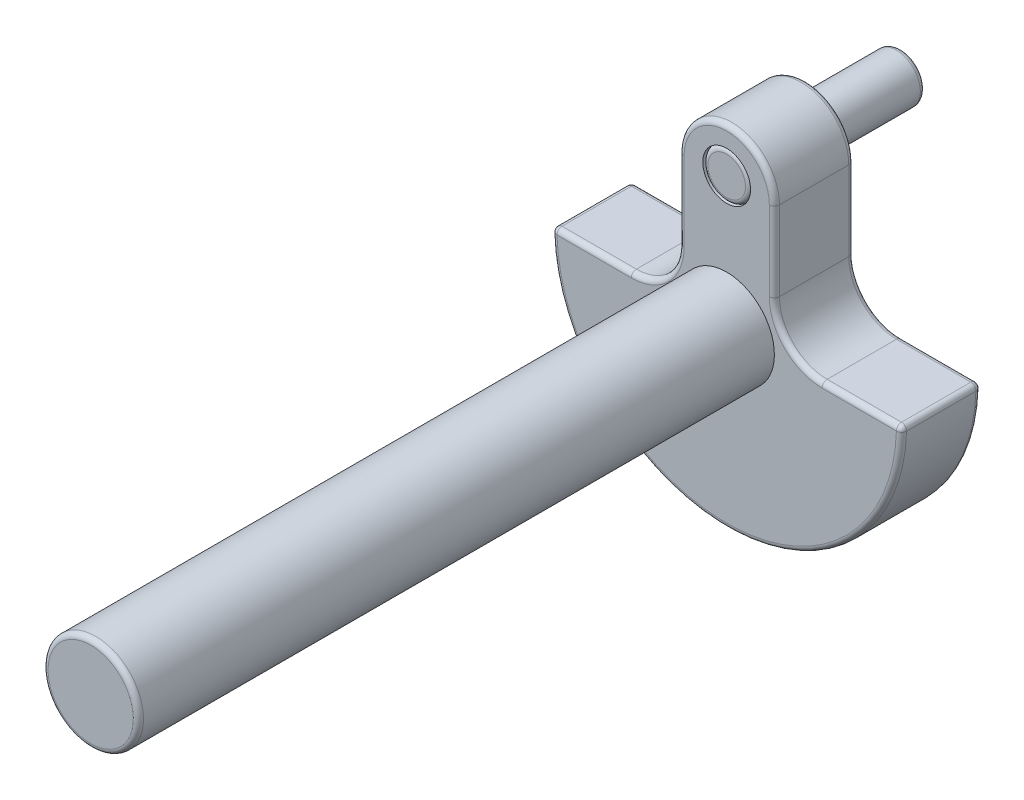
ISO-10303-21;
HEADER;
FILE_DESCRIPTION(('STEP AP214'),'2;1');
FILE_NAME('part.step','',(''),(''),'','','');
FILE_SCHEMA(('AUTOMOTIVE_DESIGN { 1 0 10303 214 1 1 1 1 }'));
ENDSEC;
DATA;
#1=APPLICATION_CONTEXT('core data for automotive mechanical design processes');
#2=APPLICATION_PROTOCOL_DEFINITION('international standard','automotive_design',2000,#1);
#3=PRODUCT_CONTEXT('',#1,'mechanical');
#4=PRODUCT('Part','Part','',(#3));
#5=PRODUCT_RELATED_PRODUCT_CATEGORY('part','',(#4));
#6=PRODUCT_DEFINITION_FORMATION('','',#4);
#7=PRODUCT_DEFINITION_CONTEXT('part definition',#1,'design');
#8=PRODUCT_DEFINITION('design','',#6,#7);
#9=PRODUCT_DEFINITION_SHAPE('','',#8);
#10=(LENGTH_UNIT() NAMED_UNIT(*) SI_UNIT(.MILLI.,.METRE.));
#11=(NAMED_UNIT(*) PLANE_ANGLE_UNIT() SI_UNIT($,.RADIAN.));
#12=(NAMED_UNIT(*) SI_UNIT($,.STERADIAN.) SOLID_ANGLE_UNIT());
#13=UNCERTAINTY_MEASURE_WITH_UNIT(LENGTH_MEASURE(1.E-05),#10,'distance_accuracy_value','');
#14=(GEOMETRIC_REPRESENTATION_CONTEXT(3) GLOBAL_UNCERTAINTY_ASSIGNED_CONTEXT((#13)) GLOBAL_UNIT_ASSIGNED_CONTEXT((#10,
#11,#12)) REPRESENTATION_CONTEXT('',''));
#15=CARTESIAN_POINT('',(0.,0.,0.));
#16=DIRECTION('',(0.,0.,1.));
#17=DIRECTION('',(1.,0.,0.));
#18=AXIS2_PLACEMENT_3D('',#15,#16,#17);
#19=CARTESIAN_POINT('',(0.,0.,35.71875));
#20=DIRECTION('',(0.,0.,1.));
#21=DIRECTION('',(0.,-1.,0.));
#22=AXIS2_PLACEMENT_3D('',#19,#20,#21);
#23=PLANE('',#22);
#24=CARTESIAN_POINT('',(0.,0.,35.71875));
#25=DIRECTION('',(0.,0.,1.));
#26=DIRECTION('',(0.,-1.,0.));
#27=AXIS2_PLACEMENT_3D('',#24,#25,#26);
#28=CIRCLE('',#27,2.12725);
#29=CARTESIAN_POINT('',(0.,-2.12725,35.71875));
#30=VERTEX_POINT('',#29);
#31=EDGE_CURVE('E11',#30,#30,#28,.T.);
#32=ORIENTED_EDGE('',*,*,#31,.T.);
#33=EDGE_LOOP('',(#32));
#34=FACE_BOUND('',#33,.T.);
#35=ADVANCED_FACE('F46',(#34),#23,.T.);
#36=CARTESIAN_POINT('',(0.,0.,3.96875));
#37=DIRECTION('',(0.,0.,-1.));
#38=DIRECTION('',(0.,1.,0.));
#39=AXIS2_PLACEMENT_3D('',#36,#37,#38);
#40=CYLINDRICAL_SURFACE('',#39,2.38125);
#41=CARTESIAN_POINT('',(0.,0.,35.46475));
#42=DIRECTION('',(0.,0.,1.));
#43=DIRECTION('',(0.,-1.,0.));
#44=AXIS2_PLACEMENT_3D('',#41,#42,#43);
#45=CIRCLE('',#44,2.38125);
#46=CARTESIAN_POINT('',(0.,-2.38125,35.46475));
#47=VERTEX_POINT('',#46);
#48=EDGE_CURVE('E54',#47,#47,#45,.F.);
#49=ORIENTED_EDGE('',*,*,#48,.T.);
#50=EDGE_LOOP('',(#49));
#51=FACE_BOUND('',#50,.T.);
#52=CARTESIAN_POINT('',(0.,0.,3.96875));
#53=DIRECTION('',(0.,0.,-1.));
#54=DIRECTION('',(0.,1.,0.));
#55=AXIS2_PLACEMENT_3D('',#52,#53,#54);
#56=CIRCLE('',#55,2.38125);
#57=CARTESIAN_POINT('',(0.,2.38125,3.96875));
#58=VERTEX_POINT('',#57);
#59=EDGE_CURVE('E59',#58,#58,#56,.T.);
#60=ORIENTED_EDGE('',*,*,#59,.F.);
#61=EDGE_LOOP('',(#60));
#62=FACE_BOUND('',#61,.T.);
#63=ADVANCED_FACE('F87',(#51,#62),#40,.T.);
#64=CARTESIAN_POINT('',(0.,2.38125,3.96875));
#65=DIRECTION('',(0.,0.,-1.));
#66=DIRECTION('',(0.,1.,0.));
#67=AXIS2_PLACEMENT_3D('',#64,#65,#66);
#68=PLANE('',#67);
#69=ORIENTED_EDGE('',*,*,#59,.T.);
#70=EDGE_LOOP('',(#69));
#71=FACE_BOUND('',#70,.T.);
#72=CARTESIAN_POINT('',(0.,0.,3.96875));
#73=DIRECTION('',(0.,0.,-1.));
#74=DIRECTION('',(0.,1.,0.));
#75=AXIS2_PLACEMENT_3D('',#72,#73,#74);
#76=CIRCLE('',#75,1.984375);
#77=CARTESIAN_POINT('',(0.,1.984375,3.96875));
#78=VERTEX_POINT('',#77);
#79=EDGE_CURVE('E64',#78,#78,#76,.T.);
#80=ORIENTED_EDGE('',*,*,#79,.F.);
#81=EDGE_LOOP('',(#80));
#82=FACE_BOUND('',#81,.T.);
#83=ADVANCED_FACE('F79',(#71,#82),#68,.T.);
#84=CARTESIAN_POINT('',(0.,0.,3.96875));
#85=DIRECTION('',(0.,0.,-1.));
#86=DIRECTION('',(0.,1.,0.));
#87=AXIS2_PLACEMENT_3D('',#84,#85,#86);
#88=CYLINDRICAL_SURFACE('',#87,1.984375);
#89=ORIENTED_EDGE('',*,*,#79,.T.);
#90=EDGE_LOOP('',(#89));
#91=FACE_BOUND('',#90,.T.);
#92=CARTESIAN_POINT('',(0.,0.,0.));
#93=DIRECTION('',(0.,0.,-1.));
#94=DIRECTION('',(0.,1.,0.));
#95=AXIS2_PLACEMENT_3D('',#92,#93,#94);
#96=CIRCLE('',#95,1.984375);
#97=CARTESIAN_POINT('',(0.,1.984375,0.));
#98=VERTEX_POINT('',#97);
#99=EDGE_CURVE('E70',#98,#98,#96,.T.);
#100=ORIENTED_EDGE('',*,*,#99,.F.);
#101=EDGE_LOOP('',(#100));
#102=FACE_BOUND('',#101,.T.);
#103=ADVANCED_FACE('F77',(#91,#102),#88,.T.);
#104=CARTESIAN_POINT('',(0.,1.984375,0.));
#105=DIRECTION('',(0.,0.,-1.));
#106=DIRECTION('',(0.,1.,0.));
#107=AXIS2_PLACEMENT_3D('',#104,#105,#106);
#108=PLANE('',#107);
#109=ORIENTED_EDGE('',*,*,#99,.T.);
#110=EDGE_LOOP('',(#109));
#111=FACE_BOUND('',#110,.T.);
#112=ADVANCED_FACE('F75',(#111),#108,.T.);
#113=CARTESIAN_POINT('',(0.,0.,35.46475));
#114=DIRECTION('',(0.,0.,1.));
#115=DIRECTION('',(0.,-1.,0.));
#116=AXIS2_PLACEMENT_3D('',#113,#114,#115);
#117=TOROIDAL_SURFACE('',#116,2.12725,0.254);
#118=ORIENTED_EDGE('',*,*,#31,.F.);
#119=EDGE_LOOP('',(#118));
#120=FACE_BOUND('',#119,.T.);
#121=ORIENTED_EDGE('',*,*,#48,.F.);
#122=EDGE_LOOP('',(#121));
#123=FACE_BOUND('',#122,.T.);
#124=ADVANCED_FACE('F48',(#120,#123),#117,.T.);
#125=CLOSED_SHELL('',(#35,#63,#83,#103,#112,#124));
#126=MANIFOLD_SOLID_BREP('B2',#125);
#127=CARTESIAN_POINT('',(0.,6.35,3.96875));
#128=DIRECTION('',(0.,0.,1.));
#129=DIRECTION('',(1.,0.,0.));
#130=AXIS2_PLACEMENT_3D('',#127,#128,#129);
#131=PLANE('',#130);
#132=CARTESIAN_POINT('',(0.,6.54079459908965,3.96875));
#133=DIRECTION('',(0.,0.,1.));
#134=DIRECTION('',(1.,0.,0.));
#135=AXIS2_PLACEMENT_3D('',#132,#133,#134);
#136=CIRCLE('',#135,0.936625);
#137=CARTESIAN_POINT('',(0.936625,6.54079459908965,3.96875));
#138=VERTEX_POINT('',#137);
#139=EDGE_CURVE('E45',#138,#138,#136,.T.);
#140=ORIENTED_EDGE('',*,*,#139,.T.);
#141=EDGE_LOOP('',(#140));
#142=FACE_BOUND('',#141,.T.);
#143=ADVANCED_FACE('F146',(#142),#131,.T.);
#144=CARTESIAN_POINT('',(0.,6.54079459908965,7.33634604540093));
#145=DIRECTION('',(0.,0.,-1.));
#146=DIRECTION('',(-1.,0.,0.));
#147=AXIS2_PLACEMENT_3D('',#144,#145,#146);
#148=CYLINDRICAL_SURFACE('',#147,1.190625);
#149=CARTESIAN_POINT('',(0.,6.54079459908965,-4.5085));
#150=DIRECTION('',(0.,0.,-1.));
#151=DIRECTION('',(-1.,0.,0.));
#152=AXIS2_PLACEMENT_3D('',#149,#150,#151);
#153=CIRCLE('',#152,1.190625);
#154=CARTESIAN_POINT('',(-1.190625,6.54079459908965,-4.5085));
#155=VERTEX_POINT('',#154);
#156=EDGE_CURVE('E153',#155,#155,#153,.F.);
#157=ORIENTED_EDGE('',*,*,#156,.T.);
#158=EDGE_LOOP('',(#157));
#159=FACE_BOUND('',#158,.T.);
#160=CARTESIAN_POINT('',(0.,6.54079459908965,3.71475));
#161=DIRECTION('',(0.,0.,1.));
#162=DIRECTION('',(1.,0.,0.));
#163=AXIS2_PLACEMENT_3D('',#160,#161,#162);
#164=CIRCLE('',#163,1.190625);
#165=CARTESIAN_POINT('',(1.190625,6.54079459908965,3.71475));
#166=VERTEX_POINT('',#165);
#167=EDGE_CURVE('E157',#166,#166,#164,.F.);
#168=ORIENTED_EDGE('',*,*,#167,.T.);
#169=EDGE_LOOP('',(#168));
#170=FACE_BOUND('',#169,.T.);
#171=ADVANCED_FACE('F177',(#159,#170),#148,.T.);
#172=CARTESIAN_POINT('',(0.,6.54079459908965,-4.7625));
#173=DIRECTION('',(0.,0.,-1.));
#174=DIRECTION('',(-1.,0.,0.));
#175=AXIS2_PLACEMENT_3D('',#172,#173,#174);
#176=PLANE('',#175);
#177=CARTESIAN_POINT('',(0.,6.54079459908965,-4.7625));
#178=DIRECTION('',(0.,0.,-1.));
#179=DIRECTION('',(-1.,0.,0.));
#180=AXIS2_PLACEMENT_3D('',#177,#178,#179);
#181=CIRCLE('',#180,0.936625);
#182=CARTESIAN_POINT('',(-0.936625,6.54079459908965,-4.7625));
#183=VERTEX_POINT('',#182);
#184=EDGE_CURVE('E161',#183,#183,#181,.T.);
#185=ORIENTED_EDGE('',*,*,#184,.T.);
#186=EDGE_LOOP('',(#185));
#187=FACE_BOUND('',#186,.T.);
#188=ADVANCED_FACE('F167',(#187),#176,.T.);
#189=CARTESIAN_POINT('',(0.,6.54079459908965,-4.5085));
#190=DIRECTION('',(0.,0.,-1.));
#191=DIRECTION('',(-1.,0.,0.));
#192=AXIS2_PLACEMENT_3D('',#189,#190,#191);
#193=TOROIDAL_SURFACE('',#192,0.936625,0.254);
#194=ORIENTED_EDGE('',*,*,#156,.F.);
#195=EDGE_LOOP('',(#194));
#196=FACE_BOUND('',#195,.T.);
#197=ORIENTED_EDGE('',*,*,#184,.F.);
#198=EDGE_LOOP('',(#197));
#199=FACE_BOUND('',#198,.T.);
#200=ADVANCED_FACE('F169',(#196,#199),#193,.T.);
#201=CARTESIAN_POINT('',(0.,6.54079459908965,3.71475));
#202=DIRECTION('',(0.,0.,1.));
#203=DIRECTION('',(1.,0.,0.));
#204=AXIS2_PLACEMENT_3D('',#201,#202,#203);
#205=TOROIDAL_SURFACE('',#204,0.936625,0.254);
#206=ORIENTED_EDGE('',*,*,#139,.F.);
#207=EDGE_LOOP('',(#206));
#208=FACE_BOUND('',#207,.T.);
#209=ORIENTED_EDGE('',*,*,#167,.F.);
#210=EDGE_LOOP('',(#209));
#211=FACE_BOUND('',#210,.T.);
#212=ADVANCED_FACE('F148',(#208,#211),#205,.T.);
#213=CLOSED_SHELL('',(#143,#171,#188,#200,#212));
#214=MANIFOLD_SOLID_BREP('B6',#213);
#215=CARTESIAN_POINT('',(0.,6.35,3.96875));
#216=DIRECTION('',(0.,0.,-1.));
#217=DIRECTION('',(-1.,0.,0.));
#218=AXIS2_PLACEMENT_3D('',#215,#216,#217);
#219=CYLINDRICAL_SURFACE('',#218,2.38125);
#220=DIRECTION('',(0.,0.,-1.));
#221=VECTOR('',#220,1.);
#222=CARTESIAN_POINT('',(-2.38125,6.35,3.96875));
#223=LINE('',#222,#221);
#224=CARTESIAN_POINT('',(-2.38125,6.35,3.71475));
#225=VERTEX_POINT('',#224);
#226=CARTESIAN_POINT('',(-2.38125,6.35,0.254));
#227=VERTEX_POINT('',#226);
#228=EDGE_CURVE('E538',#225,#227,#223,.T.);
#229=ORIENTED_EDGE('',*,*,#228,.F.);
#230=CARTESIAN_POINT('',(0.,6.35,3.71475));
#231=DIRECTION('',(0.,0.,1.));
#232=DIRECTION('',(1.,0.,0.));
#233=AXIS2_PLACEMENT_3D('',#230,#231,#232);
#234=CIRCLE('',#233,2.38125);
#235=CARTESIAN_POINT('',(2.38125,6.35,3.71475));
#236=VERTEX_POINT('',#235);
#237=EDGE_CURVE('E407',#225,#236,#234,.F.);
#238=ORIENTED_EDGE('',*,*,#237,.T.);
#239=DIRECTION('',(0.,0.,-1.));
#240=VECTOR('',#239,1.);
#241=CARTESIAN_POINT('',(2.38125,6.35,3.96875));
#242=LINE('',#241,#240);
#243=CARTESIAN_POINT('',(2.38125,6.35,0.254));
#244=VERTEX_POINT('',#243);
#245=EDGE_CURVE('E528',#236,#244,#242,.T.);
#246=ORIENTED_EDGE('',*,*,#245,.T.);
#247=CARTESIAN_POINT('',(0.,6.35,0.254));
#248=DIRECTION('',(0.,0.,1.));
#249=DIRECTION('',(1.,0.,0.));
#250=AXIS2_PLACEMENT_3D('',#247,#248,#249);
#251=CIRCLE('',#250,2.38125);
#252=EDGE_CURVE('E405',#244,#227,#251,.T.);
#253=ORIENTED_EDGE('',*,*,#252,.T.);
#254=EDGE_LOOP('',(#229,#238,#246,#253));
#255=FACE_BOUND('',#254,.T.);
#256=ADVANCED_FACE('F217',(#255),#219,.T.);
#257=CARTESIAN_POINT('',(-2.38125,6.35,3.96875));
#258=DIRECTION('',(1.,0.,0.));
#259=DIRECTION('',(0.,1.,0.));
#260=AXIS2_PLACEMENT_3D('',#257,#258,#259);
#261=PLANE('',#260);
#262=DIRECTION('',(0.,0.,-1.));
#263=VECTOR('',#262,1.);
#264=CARTESIAN_POINT('',(-2.38125,2.38125000000002,3.96875));
#265=LINE('',#264,#263);
#266=CARTESIAN_POINT('',(-2.38125,2.38125000000002,3.71475));
#267=VERTEX_POINT('',#266);
#268=CARTESIAN_POINT('',(-2.38125,2.38125000000002,0.254));
#269=VERTEX_POINT('',#268);
#270=EDGE_CURVE('E535',#267,#269,#265,.T.);
#271=ORIENTED_EDGE('',*,*,#270,.F.);
#272=DIRECTION('',(0.,-1.,0.));
#273=VECTOR('',#272,1.);
#274=CARTESIAN_POINT('',(-2.38125,6.35,3.71475));
#275=LINE('',#274,#273);
#276=EDGE_CURVE('E411',#267,#225,#275,.F.);
#277=ORIENTED_EDGE('',*,*,#276,.T.);
#278=ORIENTED_EDGE('',*,*,#228,.T.);
#279=DIRECTION('',(0.,-1.,0.));
#280=VECTOR('',#279,1.);
#281=CARTESIAN_POINT('',(-2.38125,6.35,0.254));
#282=LINE('',#281,#280);
#283=EDGE_CURVE('E409',#227,#269,#282,.T.);
#284=ORIENTED_EDGE('',*,*,#283,.T.);
#285=EDGE_LOOP('',(#271,#277,#278,#284));
#286=FACE_BOUND('',#285,.T.);
#287=ADVANCED_FACE('F601',(#286),#261,.F.);
#288=CARTESIAN_POINT('',(-4.7625,2.38125,3.96875));
#289=DIRECTION('',(0.,0.,-1.));
#290=DIRECTION('',(-1.,0.,0.));
#291=AXIS2_PLACEMENT_3D('',#288,#289,#290);
#292=CYLINDRICAL_SURFACE('',#291,2.38125);
#293=DIRECTION('',(0.,0.,-1.));
#294=VECTOR('',#293,1.);
#295=CARTESIAN_POINT('',(-4.76250000000002,0.,3.96875));
#296=LINE('',#295,#294);
#297=CARTESIAN_POINT('',(-4.76250000000002,0.,3.71475));
#298=VERTEX_POINT('',#297);
#299=CARTESIAN_POINT('',(-4.76250000000002,0.,0.254));
#300=VERTEX_POINT('',#299);
#301=EDGE_CURVE('E366',#298,#300,#296,.T.);
#302=ORIENTED_EDGE('',*,*,#301,.F.);
#303=CARTESIAN_POINT('',(-4.7625,2.38125,3.71475));
#304=DIRECTION('',(0.,0.,1.));
#305=DIRECTION('',(1.,0.,0.));
#306=AXIS2_PLACEMENT_3D('',#303,#304,#305);
#307=CIRCLE('',#306,2.38125);
#308=EDGE_CURVE('E415',#298,#267,#307,.T.);
#309=ORIENTED_EDGE('',*,*,#308,.T.);
#310=ORIENTED_EDGE('',*,*,#270,.T.);
#311=CARTESIAN_POINT('',(-4.7625,2.38125,0.254));
#312=DIRECTION('',(0.,0.,1.));
#313=DIRECTION('',(1.,0.,0.));
#314=AXIS2_PLACEMENT_3D('',#311,#312,#313);
#315=CIRCLE('',#314,2.38125);
#316=EDGE_CURVE('E413',#269,#300,#315,.F.);
#317=ORIENTED_EDGE('',*,*,#316,.T.);
#318=EDGE_LOOP('',(#302,#309,#310,#317));
#319=FACE_BOUND('',#318,.T.);
#320=ADVANCED_FACE('F610',(#319),#292,.F.);
#321=CARTESIAN_POINT('',(-4.76250000000002,0.,3.96875));
#322=DIRECTION('',(0.,-1.,0.));
#323=DIRECTION('',(1.,0.,0.));
#324=AXIS2_PLACEMENT_3D('',#321,#322,#323);
#325=PLANE('',#324);
#326=DIRECTION('',(0.,0.,-1.));
#327=VECTOR('',#326,1.);
#328=CARTESIAN_POINT('',(-8.4734439021274,0.,3.96875));
#329=LINE('',#328,#327);
#330=CARTESIAN_POINT('',(-8.4734439021274,0.,0.254));
#331=VERTEX_POINT('',#330);
#332=CARTESIAN_POINT('',(-8.4734439021274,0.,3.71475));
#333=VERTEX_POINT('',#332);
#334=EDGE_CURVE('E234',#331,#333,#329,.F.);
#335=ORIENTED_EDGE('',*,*,#334,.T.);
#336=DIRECTION('',(-1.,0.,0.));
#337=VECTOR('',#336,1.);
#338=CARTESIAN_POINT('',(-4.76250000000002,0.,3.71475));
#339=LINE('',#338,#337);
#340=EDGE_CURVE('E451',#333,#298,#339,.F.);
#341=ORIENTED_EDGE('',*,*,#340,.T.);
#342=ORIENTED_EDGE('',*,*,#301,.T.);
#343=DIRECTION('',(-1.,0.,0.));
#344=VECTOR('',#343,1.);
#345=CARTESIAN_POINT('',(-4.76250000000002,0.,0.254));
#346=LINE('',#345,#344);
#347=EDGE_CURVE('E239',#300,#331,#346,.T.);
#348=ORIENTED_EDGE('',*,*,#347,.T.);
#349=EDGE_LOOP('',(#335,#341,#342,#348));
#350=FACE_BOUND('',#349,.T.);
#351=ADVANCED_FACE('F612',(#350),#325,.F.);
#352=CARTESIAN_POINT('',(0.,0.,3.96875));
#353=DIRECTION('',(0.,0.,-1.));
#354=DIRECTION('',(-1.,0.,0.));
#355=AXIS2_PLACEMENT_3D('',#352,#353,#354);
#356=CYLINDRICAL_SURFACE('',#355,8.73125);
#357=CARTESIAN_POINT('',(0.,0.,0.254));
#358=DIRECTION('',(0.,0.,1.));
#359=DIRECTION('',(1.,0.,0.));
#360=AXIS2_PLACEMENT_3D('',#357,#358,#359);
#361=CIRCLE('',#360,8.73125);
#362=CARTESIAN_POINT('',(-8.7273298617417,-0.261610486891386,0.254));
#363=VERTEX_POINT('',#362);
#364=CARTESIAN_POINT('',(8.7273298617417,-0.261610486891381,0.254));
#365=VERTEX_POINT('',#364);
#366=EDGE_CURVE('E442',#363,#365,#361,.T.);
#367=ORIENTED_EDGE('',*,*,#366,.T.);
#368=DIRECTION('',(0.,0.,-1.));
#369=VECTOR('',#368,1.);
#370=CARTESIAN_POINT('',(8.7273298617417,-0.261610486891381,3.96875));
#371=LINE('',#370,#369);
#372=CARTESIAN_POINT('',(8.7273298617417,-0.261610486891381,3.71475));
#373=VERTEX_POINT('',#372);
#374=EDGE_CURVE('E447',#365,#373,#371,.F.);
#375=ORIENTED_EDGE('',*,*,#374,.T.);
#376=CARTESIAN_POINT('',(0.,0.,3.71475));
#377=DIRECTION('',(0.,0.,1.));
#378=DIRECTION('',(1.,0.,0.));
#379=AXIS2_PLACEMENT_3D('',#376,#377,#378);
#380=CIRCLE('',#379,8.73125);
#381=CARTESIAN_POINT('',(-8.7273298617417,-0.261610486891386,3.71475));
#382=VERTEX_POINT('',#381);
#383=EDGE_CURVE('E444',#373,#382,#380,.F.);
#384=ORIENTED_EDGE('',*,*,#383,.T.);
#385=DIRECTION('',(0.,0.,-1.));
#386=VECTOR('',#385,1.);
#387=CARTESIAN_POINT('',(-8.7273298617417,-0.261610486891386,3.96875));
#388=LINE('',#387,#386);
#389=EDGE_CURVE('E440',#382,#363,#388,.T.);
#390=ORIENTED_EDGE('',*,*,#389,.T.);
#391=EDGE_LOOP('',(#367,#375,#384,#390));
#392=FACE_BOUND('',#391,.T.);
#393=ADVANCED_FACE('F557',(#392),#356,.T.);
#394=CARTESIAN_POINT('',(4.76250000000002,0.,3.96875));
#395=DIRECTION('',(0.,1.,0.));
#396=DIRECTION('',(-1.,0.,0.));
#397=AXIS2_PLACEMENT_3D('',#394,#395,#396);
#398=PLANE('',#397);
#399=DIRECTION('',(0.,0.,-1.));
#400=VECTOR('',#399,1.);
#401=CARTESIAN_POINT('',(4.76250000000002,0.,3.96875));
#402=LINE('',#401,#400);
#403=CARTESIAN_POINT('',(4.76250000000002,0.,3.71475));
#404=VERTEX_POINT('',#403);
#405=CARTESIAN_POINT('',(4.76250000000002,0.,0.254));
#406=VERTEX_POINT('',#405);
#407=EDGE_CURVE('E348',#404,#406,#402,.T.);
#408=ORIENTED_EDGE('',*,*,#407,.F.);
#409=DIRECTION('',(1.,0.,0.));
#410=VECTOR('',#409,1.);
#411=CARTESIAN_POINT('',(4.76250000000002,0.,3.71475));
#412=LINE('',#411,#410);
#413=CARTESIAN_POINT('',(8.4734439021274,0.,3.71475));
#414=VERTEX_POINT('',#413);
#415=EDGE_CURVE('E363',#404,#414,#412,.T.);
#416=ORIENTED_EDGE('',*,*,#415,.T.);
#417=DIRECTION('',(0.,0.,1.));
#418=VECTOR('',#417,1.);
#419=CARTESIAN_POINT('',(8.4734439021274,0.,0.));
#420=LINE('',#419,#418);
#421=CARTESIAN_POINT('',(8.4734439021274,0.,0.254));
#422=VERTEX_POINT('',#421);
#423=EDGE_CURVE('E385',#414,#422,#420,.F.);
#424=ORIENTED_EDGE('',*,*,#423,.T.);
#425=DIRECTION('',(1.,0.,0.));
#426=VECTOR('',#425,1.);
#427=CARTESIAN_POINT('',(4.76250000000002,0.,0.254));
#428=LINE('',#427,#426);
#429=EDGE_CURVE('E365',#422,#406,#428,.F.);
#430=ORIENTED_EDGE('',*,*,#429,.T.);
#431=EDGE_LOOP('',(#408,#416,#424,#430));
#432=FACE_BOUND('',#431,.T.);
#433=ADVANCED_FACE('F361',(#432),#398,.T.);
#434=CARTESIAN_POINT('',(4.7625,2.38125,3.96875));
#435=DIRECTION('',(0.,0.,-1.));
#436=DIRECTION('',(-1.,0.,0.));
#437=AXIS2_PLACEMENT_3D('',#434,#435,#436);
#438=CYLINDRICAL_SURFACE('',#437,2.38125);
#439=DIRECTION('',(0.,0.,-1.));
#440=VECTOR('',#439,1.);
#441=CARTESIAN_POINT('',(2.38125,2.38125,3.96875));
#442=LINE('',#441,#440);
#443=CARTESIAN_POINT('',(2.38125,2.38125,3.71475));
#444=VERTEX_POINT('',#443);
#445=CARTESIAN_POINT('',(2.38125,2.38125,0.254));
#446=VERTEX_POINT('',#445);
#447=EDGE_CURVE('E351',#444,#446,#442,.T.);
#448=ORIENTED_EDGE('',*,*,#447,.F.);
#449=CARTESIAN_POINT('',(4.7625,2.38125,3.71475));
#450=DIRECTION('',(0.,0.,1.));
#451=DIRECTION('',(1.,0.,0.));
#452=AXIS2_PLACEMENT_3D('',#449,#450,#451);
#453=CIRCLE('',#452,2.38125);
#454=EDGE_CURVE('E345',#444,#404,#453,.T.);
#455=ORIENTED_EDGE('',*,*,#454,.T.);
#456=ORIENTED_EDGE('',*,*,#407,.T.);
#457=CARTESIAN_POINT('',(4.7625,2.38125,0.254));
#458=DIRECTION('',(0.,0.,1.));
#459=DIRECTION('',(1.,0.,0.));
#460=AXIS2_PLACEMENT_3D('',#457,#458,#459);
#461=CIRCLE('',#460,2.38125);
#462=EDGE_CURVE('E357',#406,#446,#461,.F.);
#463=ORIENTED_EDGE('',*,*,#462,.T.);
#464=EDGE_LOOP('',(#448,#455,#456,#463));
#465=FACE_BOUND('',#464,.T.);
#466=ADVANCED_FACE('F347',(#465),#438,.F.);
#467=CARTESIAN_POINT('',(2.38125,6.35,3.96875));
#468=DIRECTION('',(1.,0.,0.));
#469=DIRECTION('',(0.,1.,0.));
#470=AXIS2_PLACEMENT_3D('',#467,#468,#469);
#471=PLANE('',#470);
#472=ORIENTED_EDGE('',*,*,#245,.F.);
#473=DIRECTION('',(0.,-1.,0.));
#474=VECTOR('',#473,1.);
#475=CARTESIAN_POINT('',(2.38125,6.35,3.71475));
#476=LINE('',#475,#474);
#477=EDGE_CURVE('E403',#236,#444,#476,.T.);
#478=ORIENTED_EDGE('',*,*,#477,.T.);
#479=ORIENTED_EDGE('',*,*,#447,.T.);
#480=DIRECTION('',(0.,-1.,0.));
#481=VECTOR('',#480,1.);
#482=CARTESIAN_POINT('',(2.38125,6.35,0.254));
#483=LINE('',#482,#481);
#484=EDGE_CURVE('E356',#446,#244,#483,.F.);
#485=ORIENTED_EDGE('',*,*,#484,.T.);
#486=EDGE_LOOP('',(#472,#478,#479,#485));
#487=FACE_BOUND('',#486,.T.);
#488=ADVANCED_FACE('F589',(#487),#471,.T.);
#489=CARTESIAN_POINT('',(0.,6.35,3.96875));
#490=DIRECTION('',(0.,0.,1.));
#491=DIRECTION('',(1.,0.,0.));
#492=AXIS2_PLACEMENT_3D('',#489,#490,#491);
#493=PLANE('',#492);
#494=CARTESIAN_POINT('',(0.,0.,3.96875));
#495=DIRECTION('',(0.,0.,1.));
#496=DIRECTION('',(1.,0.,0.));
#497=AXIS2_PLACEMENT_3D('',#494,#495,#496);
#498=CIRCLE('',#497,8.47725);
#499=CARTESIAN_POINT('',(-8.4734439021274,-0.254,3.96875));
#500=VERTEX_POINT('',#499);
#501=CARTESIAN_POINT('',(8.4734439021274,-0.253999999999995,3.96875));
#502=VERTEX_POINT('',#501);
#503=EDGE_CURVE('E383',#500,#502,#498,.T.);
#504=ORIENTED_EDGE('',*,*,#503,.T.);
#505=DIRECTION('',(1.,0.,0.));
#506=VECTOR('',#505,1.);
#507=CARTESIAN_POINT('',(0.,-0.254000000000001,3.96875));
#508=LINE('',#507,#506);
#509=CARTESIAN_POINT('',(4.76250000000002,-0.253999999999998,3.96875));
#510=VERTEX_POINT('',#509);
#511=EDGE_CURVE('E399',#502,#510,#508,.F.);
#512=ORIENTED_EDGE('',*,*,#511,.T.);
#513=CARTESIAN_POINT('',(4.7625,2.38125,3.96875));
#514=DIRECTION('',(0.,0.,1.));
#515=DIRECTION('',(1.,0.,0.));
#516=AXIS2_PLACEMENT_3D('',#513,#514,#515);
#517=CIRCLE('',#516,2.63525);
#518=CARTESIAN_POINT('',(2.12725,2.38125,3.96875));
#519=VERTEX_POINT('',#518);
#520=EDGE_CURVE('E371',#510,#519,#517,.F.);
#521=ORIENTED_EDGE('',*,*,#520,.T.);
#522=DIRECTION('',(0.,-1.,0.));
#523=VECTOR('',#522,1.);
#524=CARTESIAN_POINT('',(2.12725,6.35,3.96875));
#525=LINE('',#524,#523);
#526=CARTESIAN_POINT('',(2.12725,6.35,3.96875));
#527=VERTEX_POINT('',#526);
#528=EDGE_CURVE('E396',#519,#527,#525,.F.);
#529=ORIENTED_EDGE('',*,*,#528,.T.);
#530=CARTESIAN_POINT('',(0.,6.35,3.96875));
#531=DIRECTION('',(0.,0.,1.));
#532=DIRECTION('',(1.,0.,0.));
#533=AXIS2_PLACEMENT_3D('',#530,#531,#532);
#534=CIRCLE('',#533,2.12725);
#535=CARTESIAN_POINT('',(-2.12725,6.35,3.96875));
#536=VERTEX_POINT('',#535);
#537=EDGE_CURVE('E394',#527,#536,#534,.T.);
#538=ORIENTED_EDGE('',*,*,#537,.T.);
#539=DIRECTION('',(0.,-1.,0.));
#540=VECTOR('',#539,1.);
#541=CARTESIAN_POINT('',(-2.12725,2.38125000000002,3.96875));
#542=LINE('',#541,#540);
#543=CARTESIAN_POINT('',(-2.12725,2.38125000000002,3.96875));
#544=VERTEX_POINT('',#543);
#545=EDGE_CURVE('E392',#536,#544,#542,.T.);
#546=ORIENTED_EDGE('',*,*,#545,.T.);
#547=CARTESIAN_POINT('',(-4.7625,2.38125,3.96875));
#548=DIRECTION('',(0.,0.,1.));
#549=DIRECTION('',(1.,0.,0.));
#550=AXIS2_PLACEMENT_3D('',#547,#548,#549);
#551=CIRCLE('',#550,2.63525);
#552=CARTESIAN_POINT('',(-4.76250000000002,-0.254,3.96875));
#553=VERTEX_POINT('',#552);
#554=EDGE_CURVE('E390',#544,#553,#551,.F.);
#555=ORIENTED_EDGE('',*,*,#554,.T.);
#556=DIRECTION('',(-1.,0.,0.));
#557=VECTOR('',#556,1.);
#558=CARTESIAN_POINT('',(-8.73125,-0.254,3.96875));
#559=LINE('',#558,#557);
#560=EDGE_CURVE('E381',#553,#500,#559,.T.);
#561=ORIENTED_EDGE('',*,*,#560,.T.);
#562=EDGE_LOOP('',(#504,#512,#521,#529,#538,#546,#555,#561));
#563=FACE_BOUND('',#562,.T.);
#564=CARTESIAN_POINT('',(0.,0.,3.96875));
#565=DIRECTION('',(0.,0.,1.));
#566=DIRECTION('',(1.,0.,0.));
#567=AXIS2_PLACEMENT_3D('',#564,#565,#566);
#568=CIRCLE('',#567,1.984375);
#569=CARTESIAN_POINT('',(1.984375,0.,3.96875));
#570=VERTEX_POINT('',#569);
#571=EDGE_CURVE('E523',#570,#570,#568,.T.);
#572=ORIENTED_EDGE('',*,*,#571,.F.);
#573=EDGE_LOOP('',(#572));
#574=FACE_BOUND('',#573,.T.);
#575=CARTESIAN_POINT('',(0.,6.54079459908965,3.96875));
#576=DIRECTION('',(0.,0.,1.));
#577=DIRECTION('',(1.,0.,0.));
#578=AXIS2_PLACEMENT_3D('',#575,#576,#577);
#579=CIRCLE('',#578,1.190625);
#580=CARTESIAN_POINT('',(1.190625,6.54079459908965,3.96875));
#581=VERTEX_POINT('',#580);
#582=EDGE_CURVE('E517',#581,#581,#579,.T.);
#583=ORIENTED_EDGE('',*,*,#582,.F.);
#584=EDGE_LOOP('',(#583));
#585=FACE_BOUND('',#584,.T.);
#586=ADVANCED_FACE('F633',(#563,#574,#585),#493,.T.);
#587=CARTESIAN_POINT('',(0.,6.35,0.));
#588=DIRECTION('',(0.,0.,1.));
#589=DIRECTION('',(1.,0.,0.));
#590=AXIS2_PLACEMENT_3D('',#587,#588,#589);
#591=PLANE('',#590);
#592=CARTESIAN_POINT('',(4.7625,2.38125,0.));
#593=DIRECTION('',(0.,0.,1.));
#594=DIRECTION('',(1.,0.,0.));
#595=AXIS2_PLACEMENT_3D('',#592,#593,#594);
#596=CIRCLE('',#595,2.63525);
#597=CARTESIAN_POINT('',(2.12725,2.38125,0.));
#598=VERTEX_POINT('',#597);
#599=CARTESIAN_POINT('',(4.76250000000002,-0.253999999999998,0.));
#600=VERTEX_POINT('',#599);
#601=EDGE_CURVE('E435',#598,#600,#596,.T.);
#602=ORIENTED_EDGE('',*,*,#601,.T.);
#603=DIRECTION('',(1.,0.,0.));
#604=VECTOR('',#603,1.);
#605=CARTESIAN_POINT('',(8.73125,-0.253999999999995,0.));
#606=LINE('',#605,#604);
#607=CARTESIAN_POINT('',(8.4734439021274,-0.253999999999995,0.));
#608=VERTEX_POINT('',#607);
#609=EDGE_CURVE('E437',#600,#608,#606,.T.);
#610=ORIENTED_EDGE('',*,*,#609,.T.);
#611=CARTESIAN_POINT('',(0.,0.,0.));
#612=DIRECTION('',(0.,0.,1.));
#613=DIRECTION('',(1.,0.,0.));
#614=AXIS2_PLACEMENT_3D('',#611,#612,#613);
#615=CIRCLE('',#614,8.47725);
#616=CARTESIAN_POINT('',(-8.4734439021274,-0.254,0.));
#617=VERTEX_POINT('',#616);
#618=EDGE_CURVE('E425',#608,#617,#615,.F.);
#619=ORIENTED_EDGE('',*,*,#618,.T.);
#620=DIRECTION('',(-1.,0.,0.));
#621=VECTOR('',#620,1.);
#622=CARTESIAN_POINT('',(0.,-0.254,0.));
#623=LINE('',#622,#621);
#624=CARTESIAN_POINT('',(-4.76250000000002,-0.254,0.));
#625=VERTEX_POINT('',#624);
#626=EDGE_CURVE('E423',#617,#625,#623,.F.);
#627=ORIENTED_EDGE('',*,*,#626,.T.);
#628=CARTESIAN_POINT('',(-4.7625,2.38125,0.));
#629=DIRECTION('',(0.,0.,1.));
#630=DIRECTION('',(1.,0.,0.));
#631=AXIS2_PLACEMENT_3D('',#628,#629,#630);
#632=CIRCLE('',#631,2.63525);
#633=CARTESIAN_POINT('',(-2.12725,2.38125000000002,0.));
#634=VERTEX_POINT('',#633);
#635=EDGE_CURVE('E427',#625,#634,#632,.T.);
#636=ORIENTED_EDGE('',*,*,#635,.T.);
#637=DIRECTION('',(0.,-1.,0.));
#638=VECTOR('',#637,1.);
#639=CARTESIAN_POINT('',(-2.12725,6.35,0.));
#640=LINE('',#639,#638);
#641=CARTESIAN_POINT('',(-2.12725,6.35,0.));
#642=VERTEX_POINT('',#641);
#643=EDGE_CURVE('E429',#634,#642,#640,.F.);
#644=ORIENTED_EDGE('',*,*,#643,.T.);
#645=CARTESIAN_POINT('',(0.,6.35,0.));
#646=DIRECTION('',(0.,0.,1.));
#647=DIRECTION('',(1.,0.,0.));
#648=AXIS2_PLACEMENT_3D('',#645,#646,#647);
#649=CIRCLE('',#648,2.12725);
#650=CARTESIAN_POINT('',(2.12725,6.35,0.));
#651=VERTEX_POINT('',#650);
#652=EDGE_CURVE('E431',#642,#651,#649,.F.);
#653=ORIENTED_EDGE('',*,*,#652,.T.);
#654=DIRECTION('',(0.,-1.,0.));
#655=VECTOR('',#654,1.);
#656=CARTESIAN_POINT('',(2.12725,2.38125,0.));
#657=LINE('',#656,#655);
#658=EDGE_CURVE('E433',#651,#598,#657,.T.);
#659=ORIENTED_EDGE('',*,*,#658,.T.);
#660=EDGE_LOOP('',(#602,#610,#619,#627,#636,#644,#653,#659));
#661=FACE_BOUND('',#660,.T.);
#662=CARTESIAN_POINT('',(0.,0.,0.));
#663=DIRECTION('',(0.,0.,1.));
#664=DIRECTION('',(1.,0.,0.));
#665=AXIS2_PLACEMENT_3D('',#662,#663,#664);
#666=CIRCLE('',#665,2.238375);
#667=CARTESIAN_POINT('',(2.238375,0.,0.));
#668=VERTEX_POINT('',#667);
#669=EDGE_CURVE('E420',#668,#668,#666,.T.);
#670=ORIENTED_EDGE('',*,*,#669,.T.);
#671=EDGE_LOOP('',(#670));
#672=FACE_BOUND('',#671,.T.);
#673=CARTESIAN_POINT('',(0.,6.54079459908965,0.));
#674=DIRECTION('',(0.,0.,1.));
#675=DIRECTION('',(1.,0.,0.));
#676=AXIS2_PLACEMENT_3D('',#673,#674,#675);
#677=CIRCLE('',#676,1.444625);
#678=CARTESIAN_POINT('',(1.444625,6.54079459908965,0.));
#679=VERTEX_POINT('',#678);
#680=EDGE_CURVE('E417',#679,#679,#677,.T.);
#681=ORIENTED_EDGE('',*,*,#680,.T.);
#682=EDGE_LOOP('',(#681));
#683=FACE_BOUND('',#682,.T.);
#684=ADVANCED_FACE('F579',(#661,#672,#683),#591,.F.);
#685=CARTESIAN_POINT('',(0.,6.54079459908965,0.));
#686=DIRECTION('',(0.,0.,1.));
#687=DIRECTION('',(1.,0.,0.));
#688=AXIS2_PLACEMENT_3D('',#685,#686,#687);
#689=CYLINDRICAL_SURFACE('',#688,1.190625);
#690=CARTESIAN_POINT('',(0.,6.54079459908965,0.254));
#691=DIRECTION('',(0.,0.,1.));
#692=DIRECTION('',(1.,0.,0.));
#693=AXIS2_PLACEMENT_3D('',#690,#691,#692);
#694=CIRCLE('',#693,1.190625);
#695=CARTESIAN_POINT('',(1.190625,6.54079459908965,0.254));
#696=VERTEX_POINT('',#695);
#697=EDGE_CURVE('E144',#696,#696,#694,.F.);
#698=ORIENTED_EDGE('',*,*,#697,.T.);
#699=EDGE_LOOP('',(#698));
#700=FACE_BOUND('',#699,.T.);
#701=ORIENTED_EDGE('',*,*,#582,.T.);
#702=EDGE_LOOP('',(#701));
#703=FACE_BOUND('',#702,.T.);
#704=ADVANCED_FACE('F667',(#700,#703),#689,.F.);
#705=CARTESIAN_POINT('',(0.,0.,0.));
#706=DIRECTION('',(0.,0.,1.));
#707=DIRECTION('',(1.,0.,0.));
#708=AXIS2_PLACEMENT_3D('',#705,#706,#707);
#709=CYLINDRICAL_SURFACE('',#708,1.984375);
#710=CARTESIAN_POINT('',(0.,0.,0.254));
#711=DIRECTION('',(0.,0.,1.));
#712=DIRECTION('',(1.,0.,0.));
#713=AXIS2_PLACEMENT_3D('',#710,#711,#712);
#714=CIRCLE('',#713,1.984375);
#715=CARTESIAN_POINT('',(1.984375,0.,0.254));
#716=VERTEX_POINT('',#715);
#717=EDGE_CURVE('E226',#716,#716,#714,.F.);
#718=ORIENTED_EDGE('',*,*,#717,.T.);
#719=EDGE_LOOP('',(#718));
#720=FACE_BOUND('',#719,.T.);
#721=ORIENTED_EDGE('',*,*,#571,.T.);
#722=EDGE_LOOP('',(#721));
#723=FACE_BOUND('',#722,.T.);
#724=ADVANCED_FACE('F672',(#720,#723),#709,.F.);
#725=CARTESIAN_POINT('',(-2.12725,6.35,0.254));
#726=DIRECTION('',(0.,-1.,0.));
#727=DIRECTION('',(1.,0.,0.));
#728=AXIS2_PLACEMENT_3D('',#725,#726,#727);
#729=CYLINDRICAL_SURFACE('',#728,0.254);
#730=CARTESIAN_POINT('',(-2.12725,2.38125000000002,0.254));
#731=DIRECTION('',(0.,-1.,0.));
#732=DIRECTION('',(0.,0.,-1.));
#733=AXIS2_PLACEMENT_3D('',#730,#731,#732);
#734=CIRCLE('',#733,0.254);
#735=EDGE_CURVE('E510',#269,#634,#734,.T.);
#736=ORIENTED_EDGE('',*,*,#735,.F.);
#737=ORIENTED_EDGE('',*,*,#283,.F.);
#738=CARTESIAN_POINT('',(-2.12725,6.35,0.254));
#739=DIRECTION('',(0.,1.,0.));
#740=DIRECTION('',(0.,0.,1.));
#741=AXIS2_PLACEMENT_3D('',#738,#739,#740);
#742=CIRCLE('',#741,0.254);
#743=EDGE_CURVE('E221',#642,#227,#742,.T.);
#744=ORIENTED_EDGE('',*,*,#743,.F.);
#745=ORIENTED_EDGE('',*,*,#643,.F.);
#746=EDGE_LOOP('',(#736,#737,#744,#745));
#747=FACE_BOUND('',#746,.T.);
#748=ADVANCED_FACE('F604',(#747),#729,.T.);
#749=CARTESIAN_POINT('',(0.,6.35,0.254));
#750=DIRECTION('',(0.,0.,1.));
#751=DIRECTION('',(1.,0.,0.));
#752=AXIS2_PLACEMENT_3D('',#749,#750,#751);
#753=TOROIDAL_SURFACE('',#752,2.12725,0.254);
#754=ORIENTED_EDGE('',*,*,#743,.T.);
#755=ORIENTED_EDGE('',*,*,#252,.F.);
#756=CARTESIAN_POINT('',(2.12725,6.35,0.254));
#757=DIRECTION('',(0.,-1.,0.));
#758=DIRECTION('',(0.,0.,-1.));
#759=AXIS2_PLACEMENT_3D('',#756,#757,#758);
#760=CIRCLE('',#759,0.254);
#761=EDGE_CURVE('E508',#651,#244,#760,.T.);
#762=ORIENTED_EDGE('',*,*,#761,.F.);
#763=ORIENTED_EDGE('',*,*,#652,.F.);
#764=EDGE_LOOP('',(#754,#755,#762,#763));
#765=FACE_BOUND('',#764,.T.);
#766=ADVANCED_FACE('F594',(#765),#753,.T.);
#767=CARTESIAN_POINT('',(-4.7625,2.38125,0.254));
#768=DIRECTION('',(0.,0.,1.));
#769=DIRECTION('',(1.,0.,0.));
#770=AXIS2_PLACEMENT_3D('',#767,#768,#769);
#771=TOROIDAL_SURFACE('',#770,2.63525,0.254);
#772=ORIENTED_EDGE('',*,*,#735,.T.);
#773=ORIENTED_EDGE('',*,*,#635,.F.);
#774=CARTESIAN_POINT('',(-4.76250000000002,-0.254,0.254));
#775=DIRECTION('',(-1.,0.,0.));
#776=DIRECTION('',(0.,-1.,0.));
#777=AXIS2_PLACEMENT_3D('',#774,#775,#776);
#778=CIRCLE('',#777,0.254);
#779=EDGE_CURVE('E505',#300,#625,#778,.T.);
#780=ORIENTED_EDGE('',*,*,#779,.F.);
#781=ORIENTED_EDGE('',*,*,#316,.F.);
#782=EDGE_LOOP('',(#772,#773,#780,#781));
#783=FACE_BOUND('',#782,.T.);
#784=ADVANCED_FACE('F607',(#783),#771,.T.);
#785=CARTESIAN_POINT('',(2.12725,6.35,0.254));
#786=DIRECTION('',(0.,1.,0.));
#787=DIRECTION('',(-1.,0.,0.));
#788=AXIS2_PLACEMENT_3D('',#785,#786,#787);
#789=CYLINDRICAL_SURFACE('',#788,0.254);
#790=ORIENTED_EDGE('',*,*,#761,.T.);
#791=ORIENTED_EDGE('',*,*,#484,.F.);
#792=CARTESIAN_POINT('',(2.12725,2.38125,0.254));
#793=DIRECTION('',(0.,-1.,0.));
#794=DIRECTION('',(0.,0.,-1.));
#795=AXIS2_PLACEMENT_3D('',#792,#793,#794);
#796=CIRCLE('',#795,0.254);
#797=EDGE_CURVE('E502',#598,#446,#796,.T.);
#798=ORIENTED_EDGE('',*,*,#797,.F.);
#799=ORIENTED_EDGE('',*,*,#658,.F.);
#800=EDGE_LOOP('',(#790,#791,#798,#799));
#801=FACE_BOUND('',#800,.T.);
#802=ADVANCED_FACE('F592',(#801),#789,.T.);
#803=CARTESIAN_POINT('',(-4.76250000000002,-0.254,0.254));
#804=DIRECTION('',(-1.,0.,0.));
#805=DIRECTION('',(0.,-1.,0.));
#806=AXIS2_PLACEMENT_3D('',#803,#804,#805);
#807=CYLINDRICAL_SURFACE('',#806,0.254);
#808=ORIENTED_EDGE('',*,*,#779,.T.);
#809=ORIENTED_EDGE('',*,*,#626,.F.);
#810=CARTESIAN_POINT('',(-8.4734439021274,-0.254,0.254));
#811=DIRECTION('',(-1.,0.,0.));
#812=DIRECTION('',(0.,0.,1.));
#813=AXIS2_PLACEMENT_3D('',#810,#811,#812);
#814=CIRCLE('',#813,0.254);
#815=EDGE_CURVE('E499',#331,#617,#814,.T.);
#816=ORIENTED_EDGE('',*,*,#815,.F.);
#817=ORIENTED_EDGE('',*,*,#347,.F.);
#818=EDGE_LOOP('',(#808,#809,#816,#817));
#819=FACE_BOUND('',#818,.T.);
#820=ADVANCED_FACE('F827',(#819),#807,.T.);
#821=CARTESIAN_POINT('',(4.7625,2.38125,0.254));
#822=DIRECTION('',(0.,0.,1.));
#823=DIRECTION('',(1.,0.,0.));
#824=AXIS2_PLACEMENT_3D('',#821,#822,#823);
#825=TOROIDAL_SURFACE('',#824,2.63525,0.254);
#826=ORIENTED_EDGE('',*,*,#797,.T.);
#827=ORIENTED_EDGE('',*,*,#462,.F.);
#828=CARTESIAN_POINT('',(4.76250000000002,-0.253999999999998,0.254));
#829=DIRECTION('',(1.,0.,0.));
#830=DIRECTION('',(0.,0.,-1.));
#831=AXIS2_PLACEMENT_3D('',#828,#829,#830);
#832=CIRCLE('',#831,0.254);
#833=EDGE_CURVE('E493',#600,#406,#832,.T.);
#834=ORIENTED_EDGE('',*,*,#833,.F.);
#835=ORIENTED_EDGE('',*,*,#601,.F.);
#836=EDGE_LOOP('',(#826,#827,#834,#835));
#837=FACE_BOUND('',#836,.T.);
#838=ADVANCED_FACE('F585',(#837),#825,.T.);
#839=CARTESIAN_POINT('',(-8.4734439021274,-0.254,0.254));
#840=DIRECTION('',(0.,0.,1.));
#841=DIRECTION('',(1.,0.,0.));
#842=AXIS2_PLACEMENT_3D('',#839,#840,#841);
#843=SPHERICAL_SURFACE('',#842,0.254);
#844=CARTESIAN_POINT('',(-8.4734439021274,-0.254,0.254));
#845=DIRECTION('',(0.,0.,-1.));
#846=DIRECTION('',(-1.,0.,0.));
#847=AXIS2_PLACEMENT_3D('',#844,#845,#846);
#848=CIRCLE('',#847,0.254);
#849=EDGE_CURVE('E487',#331,#363,#848,.F.);
#850=ORIENTED_EDGE('',*,*,#849,.F.);
#851=ORIENTED_EDGE('',*,*,#815,.T.);
#852=CARTESIAN_POINT('',(-8.4734439021274,-0.254,0.254));
#853=DIRECTION('',(-0.0299625468164793,0.999551022103559,0.));
#854=DIRECTION('',(-0.99955102210356,-0.0299625468164794,0.));
#855=AXIS2_PLACEMENT_3D('',#852,#853,#854);
#856=CIRCLE('',#855,0.254);
#857=EDGE_CURVE('E490',#363,#617,#856,.F.);
#858=ORIENTED_EDGE('',*,*,#857,.F.);
#859=EDGE_LOOP('',(#850,#851,#858));
#860=FACE_BOUND('',#859,.T.);
#861=ADVANCED_FACE('F574',(#860),#843,.T.);
#862=CARTESIAN_POINT('',(-4.7625,2.38125,3.71475));
#863=DIRECTION('',(0.,0.,1.));
#864=DIRECTION('',(1.,0.,0.));
#865=AXIS2_PLACEMENT_3D('',#862,#863,#864);
#866=TOROIDAL_SURFACE('',#865,2.63525,0.254);
#867=CARTESIAN_POINT('',(-4.76250000000002,-0.254,3.71475));
#868=DIRECTION('',(-1.,0.,0.));
#869=DIRECTION('',(0.,-1.,0.));
#870=AXIS2_PLACEMENT_3D('',#867,#868,#869);
#871=CIRCLE('',#870,0.254);
#872=EDGE_CURVE('E484',#553,#298,#871,.T.);
#873=ORIENTED_EDGE('',*,*,#872,.F.);
#874=ORIENTED_EDGE('',*,*,#554,.F.);
#875=CARTESIAN_POINT('',(-2.12725,2.38125000000002,3.71475));
#876=DIRECTION('',(0.,1.,0.));
#877=DIRECTION('',(0.,0.,1.));
#878=AXIS2_PLACEMENT_3D('',#875,#876,#877);
#879=CIRCLE('',#878,0.254);
#880=EDGE_CURVE('E496',#267,#544,#879,.T.);
#881=ORIENTED_EDGE('',*,*,#880,.F.);
#882=ORIENTED_EDGE('',*,*,#308,.F.);
#883=EDGE_LOOP('',(#873,#874,#881,#882));
#884=FACE_BOUND('',#883,.T.);
#885=ADVANCED_FACE('F619',(#884),#866,.T.);
#886=CARTESIAN_POINT('',(-2.12725,6.35,3.71475));
#887=DIRECTION('',(0.,1.,0.));
#888=DIRECTION('',(-1.,0.,0.));
#889=AXIS2_PLACEMENT_3D('',#886,#887,#888);
#890=CYLINDRICAL_SURFACE('',#889,0.254);
#891=ORIENTED_EDGE('',*,*,#880,.T.);
#892=ORIENTED_EDGE('',*,*,#545,.F.);
#893=CARTESIAN_POINT('',(-2.12725,6.35,3.71475));
#894=DIRECTION('',(0.,1.,0.));
#895=DIRECTION('',(0.,0.,1.));
#896=AXIS2_PLACEMENT_3D('',#893,#894,#895);
#897=CIRCLE('',#896,0.254);
#898=EDGE_CURVE('E481',#225,#536,#897,.T.);
#899=ORIENTED_EDGE('',*,*,#898,.F.);
#900=ORIENTED_EDGE('',*,*,#276,.F.);
#901=EDGE_LOOP('',(#891,#892,#899,#900));
#902=FACE_BOUND('',#901,.T.);
#903=ADVANCED_FACE('F623',(#902),#890,.T.);
#904=CARTESIAN_POINT('',(0.,-0.254000000000001,0.254));
#905=DIRECTION('',(-1.,0.,0.));
#906=DIRECTION('',(0.,-1.,0.));
#907=AXIS2_PLACEMENT_3D('',#904,#905,#906);
#908=CYLINDRICAL_SURFACE('',#907,0.254);
#909=ORIENTED_EDGE('',*,*,#833,.T.);
#910=ORIENTED_EDGE('',*,*,#429,.F.);
#911=CARTESIAN_POINT('',(8.4734439021274,-0.253999999999995,0.254));
#912=DIRECTION('',(1.,0.,0.));
#913=DIRECTION('',(0.,0.,-1.));
#914=AXIS2_PLACEMENT_3D('',#911,#912,#913);
#915=CIRCLE('',#914,0.254);
#916=EDGE_CURVE('E478',#608,#422,#915,.T.);
#917=ORIENTED_EDGE('',*,*,#916,.F.);
#918=ORIENTED_EDGE('',*,*,#609,.F.);
#919=EDGE_LOOP('',(#909,#910,#917,#918));
#920=FACE_BOUND('',#919,.T.);
#921=ADVANCED_FACE('F545',(#920),#908,.T.);
#922=CARTESIAN_POINT('',(0.,0.,0.254));
#923=DIRECTION('',(0.,0.,1.));
#924=DIRECTION('',(1.,0.,0.));
#925=AXIS2_PLACEMENT_3D('',#922,#923,#924);
#926=TOROIDAL_SURFACE('',#925,8.47725,0.254);
#927=ORIENTED_EDGE('',*,*,#857,.T.);
#928=ORIENTED_EDGE('',*,*,#618,.F.);
#929=CARTESIAN_POINT('',(8.4734439021274,-0.253999999999995,0.254));
#930=DIRECTION('',(0.0299625468164789,0.999551022103559,0.));
#931=DIRECTION('',(-0.99955102210356,0.0299625468164789,0.));
#932=AXIS2_PLACEMENT_3D('',#929,#930,#931);
#933=CIRCLE('',#932,0.254);
#934=EDGE_CURVE('E476',#365,#608,#933,.T.);
#935=ORIENTED_EDGE('',*,*,#934,.F.);
#936=ORIENTED_EDGE('',*,*,#366,.F.);
#937=EDGE_LOOP('',(#927,#928,#935,#936));
#938=FACE_BOUND('',#937,.T.);
#939=ADVANCED_FACE('F576',(#938),#926,.T.);
#940=CARTESIAN_POINT('',(-8.4734439021274,-0.254,3.96875));
#941=DIRECTION('',(0.,0.,-1.));
#942=DIRECTION('',(-1.,0.,0.));
#943=AXIS2_PLACEMENT_3D('',#940,#941,#942);
#944=CYLINDRICAL_SURFACE('',#943,0.254);
#945=ORIENTED_EDGE('',*,*,#849,.T.);
#946=ORIENTED_EDGE('',*,*,#389,.F.);
#947=CARTESIAN_POINT('',(-8.4734439021274,-0.254,3.71475));
#948=DIRECTION('',(0.,0.,1.));
#949=DIRECTION('',(1.,0.,0.));
#950=AXIS2_PLACEMENT_3D('',#947,#948,#949);
#951=CIRCLE('',#950,0.254);
#952=EDGE_CURVE('E473',#333,#382,#951,.T.);
#953=ORIENTED_EDGE('',*,*,#952,.F.);
#954=ORIENTED_EDGE('',*,*,#334,.F.);
#955=EDGE_LOOP('',(#945,#946,#953,#954));
#956=FACE_BOUND('',#955,.T.);
#957=ADVANCED_FACE('F570',(#956),#944,.T.);
#958=CARTESIAN_POINT('',(0.,-0.254,3.71475));
#959=DIRECTION('',(1.,0.,0.));
#960=DIRECTION('',(0.,1.,0.));
#961=AXIS2_PLACEMENT_3D('',#958,#959,#960);
#962=CYLINDRICAL_SURFACE('',#961,0.254);
#963=ORIENTED_EDGE('',*,*,#872,.T.);
#964=ORIENTED_EDGE('',*,*,#340,.F.);
#965=CARTESIAN_POINT('',(-8.4734439021274,-0.254,3.71475));
#966=DIRECTION('',(-1.,0.,0.));
#967=DIRECTION('',(0.,0.,1.));
#968=AXIS2_PLACEMENT_3D('',#965,#966,#967);
#969=CIRCLE('',#968,0.254);
#970=EDGE_CURVE('E470',#500,#333,#969,.T.);
#971=ORIENTED_EDGE('',*,*,#970,.F.);
#972=ORIENTED_EDGE('',*,*,#560,.F.);
#973=EDGE_LOOP('',(#963,#964,#971,#972));
#974=FACE_BOUND('',#973,.T.);
#975=ADVANCED_FACE('F614',(#974),#962,.T.);
#976=CARTESIAN_POINT('',(0.,6.35,3.71475));
#977=DIRECTION('',(0.,0.,1.));
#978=DIRECTION('',(1.,0.,0.));
#979=AXIS2_PLACEMENT_3D('',#976,#977,#978);
#980=TOROIDAL_SURFACE('',#979,2.12725,0.254);
#981=ORIENTED_EDGE('',*,*,#898,.T.);
#982=ORIENTED_EDGE('',*,*,#537,.F.);
#983=CARTESIAN_POINT('',(2.12725,6.35,3.71475));
#984=DIRECTION('',(0.,-1.,0.));
#985=DIRECTION('',(0.,0.,-1.));
#986=AXIS2_PLACEMENT_3D('',#983,#984,#985);
#987=CIRCLE('',#986,0.254);
#988=EDGE_CURVE('E467',#236,#527,#987,.T.);
#989=ORIENTED_EDGE('',*,*,#988,.F.);
#990=ORIENTED_EDGE('',*,*,#237,.F.);
#991=EDGE_LOOP('',(#981,#982,#989,#990));
#992=FACE_BOUND('',#991,.T.);
#993=ADVANCED_FACE('F628',(#992),#980,.T.);
#994=CARTESIAN_POINT('',(8.4734439021274,-0.253999999999995,0.254));
#995=DIRECTION('',(0.,0.,1.));
#996=DIRECTION('',(1.,0.,0.));
#997=AXIS2_PLACEMENT_3D('',#994,#995,#996);
#998=SPHERICAL_SURFACE('',#997,0.254);
#999=ORIENTED_EDGE('',*,*,#934,.T.);
#1000=ORIENTED_EDGE('',*,*,#916,.T.);
#1001=CARTESIAN_POINT('',(8.4734439021274,-0.253999999999995,0.254));
#1002=DIRECTION('',(0.,0.,-1.));
#1003=DIRECTION('',(-1.,0.,0.));
#1004=AXIS2_PLACEMENT_3D('',#1001,#1002,#1003);
#1005=CIRCLE('',#1004,0.254);
#1006=EDGE_CURVE('E464',#365,#422,#1005,.F.);
#1007=ORIENTED_EDGE('',*,*,#1006,.F.);
#1008=EDGE_LOOP('',(#999,#1000,#1007));
#1009=FACE_BOUND('',#1008,.T.);
#1010=ADVANCED_FACE('F551',(#1009),#998,.T.);
#1011=CARTESIAN_POINT('',(-8.4734439021274,-0.254,3.71475));
#1012=DIRECTION('',(0.,0.,1.));
#1013=DIRECTION('',(1.,0.,0.));
#1014=AXIS2_PLACEMENT_3D('',#1011,#1012,#1013);
#1015=SPHERICAL_SURFACE('',#1014,0.254);
#1016=ORIENTED_EDGE('',*,*,#970,.T.);
#1017=ORIENTED_EDGE('',*,*,#952,.T.);
#1018=CARTESIAN_POINT('',(-8.4734439021274,-0.254,3.71475));
#1019=DIRECTION('',(-0.0299625468164795,0.999551022103559,0.));
#1020=DIRECTION('',(-0.999551022103559,-0.0299625468164796,0.));
#1021=AXIS2_PLACEMENT_3D('',#1018,#1019,#1020);
#1022=CIRCLE('',#1021,0.254);
#1023=EDGE_CURVE('E462',#500,#382,#1022,.F.);
#1024=ORIENTED_EDGE('',*,*,#1023,.F.);
#1025=EDGE_LOOP('',(#1016,#1017,#1024));
#1026=FACE_BOUND('',#1025,.T.);
#1027=ADVANCED_FACE('F567',(#1026),#1015,.T.);
#1028=CARTESIAN_POINT('',(2.12725,6.35,3.71475));
#1029=DIRECTION('',(0.,-1.,0.));
#1030=DIRECTION('',(1.,0.,0.));
#1031=AXIS2_PLACEMENT_3D('',#1028,#1029,#1030);
#1032=CYLINDRICAL_SURFACE('',#1031,0.254);
#1033=ORIENTED_EDGE('',*,*,#988,.T.);
#1034=ORIENTED_EDGE('',*,*,#528,.F.);
#1035=CARTESIAN_POINT('',(2.12725,2.38125,3.71475));
#1036=DIRECTION('',(0.,-1.,0.));
#1037=DIRECTION('',(0.,0.,-1.));
#1038=AXIS2_PLACEMENT_3D('',#1035,#1036,#1037);
#1039=CIRCLE('',#1038,0.254);
#1040=EDGE_CURVE('E460',#444,#519,#1039,.T.);
#1041=ORIENTED_EDGE('',*,*,#1040,.F.);
#1042=ORIENTED_EDGE('',*,*,#477,.F.);
#1043=EDGE_LOOP('',(#1033,#1034,#1041,#1042));
#1044=FACE_BOUND('',#1043,.T.);
#1045=ADVANCED_FACE('F631',(#1044),#1032,.T.);
#1046=CARTESIAN_POINT('',(8.4734439021274,-0.253999999999995,3.96875));
#1047=DIRECTION('',(0.,0.,-1.));
#1048=DIRECTION('',(-1.,0.,0.));
#1049=AXIS2_PLACEMENT_3D('',#1046,#1047,#1048);
#1050=CYLINDRICAL_SURFACE('',#1049,0.254);
#1051=ORIENTED_EDGE('',*,*,#1006,.T.);
#1052=ORIENTED_EDGE('',*,*,#423,.F.);
#1053=CARTESIAN_POINT('',(8.4734439021274,-0.253999999999995,3.71475));
#1054=DIRECTION('',(0.,0.,1.));
#1055=DIRECTION('',(1.,0.,0.));
#1056=AXIS2_PLACEMENT_3D('',#1053,#1054,#1055);
#1057=CIRCLE('',#1056,0.254);
#1058=EDGE_CURVE('E458',#373,#414,#1057,.T.);
#1059=ORIENTED_EDGE('',*,*,#1058,.F.);
#1060=ORIENTED_EDGE('',*,*,#374,.F.);
#1061=EDGE_LOOP('',(#1051,#1052,#1059,#1060));
#1062=FACE_BOUND('',#1061,.T.);
#1063=ADVANCED_FACE('F554',(#1062),#1050,.T.);
#1064=CARTESIAN_POINT('',(0.,0.,3.71475));
#1065=DIRECTION('',(0.,0.,1.));
#1066=DIRECTION('',(1.,0.,0.));
#1067=AXIS2_PLACEMENT_3D('',#1064,#1065,#1066);
#1068=TOROIDAL_SURFACE('',#1067,8.47725,0.254);
#1069=ORIENTED_EDGE('',*,*,#1023,.T.);
#1070=ORIENTED_EDGE('',*,*,#383,.F.);
#1071=CARTESIAN_POINT('',(8.4734439021274,-0.253999999999995,3.71475));
#1072=DIRECTION('',(0.0299625468164787,0.99955102210356,0.));
#1073=DIRECTION('',(-0.99955102210356,0.0299625468164787,0.));
#1074=AXIS2_PLACEMENT_3D('',#1071,#1072,#1073);
#1075=CIRCLE('',#1074,0.254);
#1076=EDGE_CURVE('E375',#502,#373,#1075,.T.);
#1077=ORIENTED_EDGE('',*,*,#1076,.F.);
#1078=ORIENTED_EDGE('',*,*,#503,.F.);
#1079=EDGE_LOOP('',(#1069,#1070,#1077,#1078));
#1080=FACE_BOUND('',#1079,.T.);
#1081=ADVANCED_FACE('F561',(#1080),#1068,.T.);
#1082=CARTESIAN_POINT('',(4.7625,2.38125,3.71475));
#1083=DIRECTION('',(0.,0.,1.));
#1084=DIRECTION('',(1.,0.,0.));
#1085=AXIS2_PLACEMENT_3D('',#1082,#1083,#1084);
#1086=TOROIDAL_SURFACE('',#1085,2.63525,0.254);
#1087=ORIENTED_EDGE('',*,*,#1040,.T.);
#1088=ORIENTED_EDGE('',*,*,#520,.F.);
#1089=CARTESIAN_POINT('',(4.76250000000002,-0.253999999999998,3.71475));
#1090=DIRECTION('',(1.,0.,0.));
#1091=DIRECTION('',(0.,0.,-1.));
#1092=AXIS2_PLACEMENT_3D('',#1089,#1090,#1091);
#1093=CIRCLE('',#1092,0.254);
#1094=EDGE_CURVE('E369',#404,#510,#1093,.T.);
#1095=ORIENTED_EDGE('',*,*,#1094,.F.);
#1096=ORIENTED_EDGE('',*,*,#454,.F.);
#1097=EDGE_LOOP('',(#1087,#1088,#1095,#1096));
#1098=FACE_BOUND('',#1097,.T.);
#1099=ADVANCED_FACE('F370',(#1098),#1086,.T.);
#1100=CARTESIAN_POINT('',(8.4734439021274,-0.253999999999995,3.71475));
#1101=DIRECTION('',(0.,0.,1.));
#1102=DIRECTION('',(1.,0.,0.));
#1103=AXIS2_PLACEMENT_3D('',#1100,#1101,#1102);
#1104=SPHERICAL_SURFACE('',#1103,0.254);
#1105=ORIENTED_EDGE('',*,*,#1076,.T.);
#1106=ORIENTED_EDGE('',*,*,#1058,.T.);
#1107=CARTESIAN_POINT('',(8.4734439021274,-0.253999999999995,3.71475));
#1108=DIRECTION('',(1.,0.,0.));
#1109=DIRECTION('',(0.,0.,-1.));
#1110=AXIS2_PLACEMENT_3D('',#1107,#1108,#1109);
#1111=CIRCLE('',#1110,0.254);
#1112=EDGE_CURVE('E376',#502,#414,#1111,.F.);
#1113=ORIENTED_EDGE('',*,*,#1112,.F.);
#1114=EDGE_LOOP('',(#1105,#1106,#1113));
#1115=FACE_BOUND('',#1114,.T.);
#1116=ADVANCED_FACE('F636',(#1115),#1104,.T.);
#1117=CARTESIAN_POINT('',(4.76250000000002,-0.253999999999998,3.71475));
#1118=DIRECTION('',(1.,0.,0.));
#1119=DIRECTION('',(0.,1.,0.));
#1120=AXIS2_PLACEMENT_3D('',#1117,#1118,#1119);
#1121=CYLINDRICAL_SURFACE('',#1120,0.254);
#1122=ORIENTED_EDGE('',*,*,#1094,.T.);
#1123=ORIENTED_EDGE('',*,*,#511,.F.);
#1124=ORIENTED_EDGE('',*,*,#1112,.T.);
#1125=ORIENTED_EDGE('',*,*,#415,.F.);
#1126=EDGE_LOOP('',(#1122,#1123,#1124,#1125));
#1127=FACE_BOUND('',#1126,.T.);
#1128=ADVANCED_FACE('F378',(#1127),#1121,.T.);
#1129=CARTESIAN_POINT('',(0.,0.,0.254));
#1130=DIRECTION('',(0.,0.,1.));
#1131=DIRECTION('',(1.,0.,0.));
#1132=AXIS2_PLACEMENT_3D('',#1129,#1130,#1131);
#1133=TOROIDAL_SURFACE('',#1132,2.238375,0.254);
#1134=ORIENTED_EDGE('',*,*,#717,.F.);
#1135=EDGE_LOOP('',(#1134));
#1136=FACE_BOUND('',#1135,.T.);
#1137=ORIENTED_EDGE('',*,*,#669,.F.);
#1138=EDGE_LOOP('',(#1137));
#1139=FACE_BOUND('',#1138,.T.);
#1140=ADVANCED_FACE('F643',(#1136,#1139),#1133,.T.);
#1141=CARTESIAN_POINT('',(0.,6.54079459908965,0.254));
#1142=DIRECTION('',(0.,0.,1.));
#1143=DIRECTION('',(1.,0.,0.));
#1144=AXIS2_PLACEMENT_3D('',#1141,#1142,#1143);
#1145=TOROIDAL_SURFACE('',#1144,1.444625,0.254);
#1146=ORIENTED_EDGE('',*,*,#697,.F.);
#1147=EDGE_LOOP('',(#1146));
#1148=FACE_BOUND('',#1147,.T.);
#1149=ORIENTED_EDGE('',*,*,#680,.F.);
#1150=EDGE_LOOP('',(#1149));
#1151=FACE_BOUND('',#1150,.T.);
#1152=ADVANCED_FACE('F219',(#1148,#1151),#1145,.T.);
#1153=CLOSED_SHELL('',(#256,#287,#320,#351,#393,#433,#466,#488,#586,#684,#704,#724,#748,#766,
#784,#802,#820,#838,#861,#885,#903,#921,#939,#957,#975,#993,#1010,#1027,#1045,#1063,#1081,#1099,
#1116,#1128,#1140,#1152));
#1154=MANIFOLD_SOLID_BREP('B40',#1153);
#1155=ADVANCED_BREP_SHAPE_REPRESENTATION('',(#18,#126,#214,#1154),#14);
#1156=SHAPE_DEFINITION_REPRESENTATION(#9,#1155);
ENDSEC;
END-ISO-10303-21;
